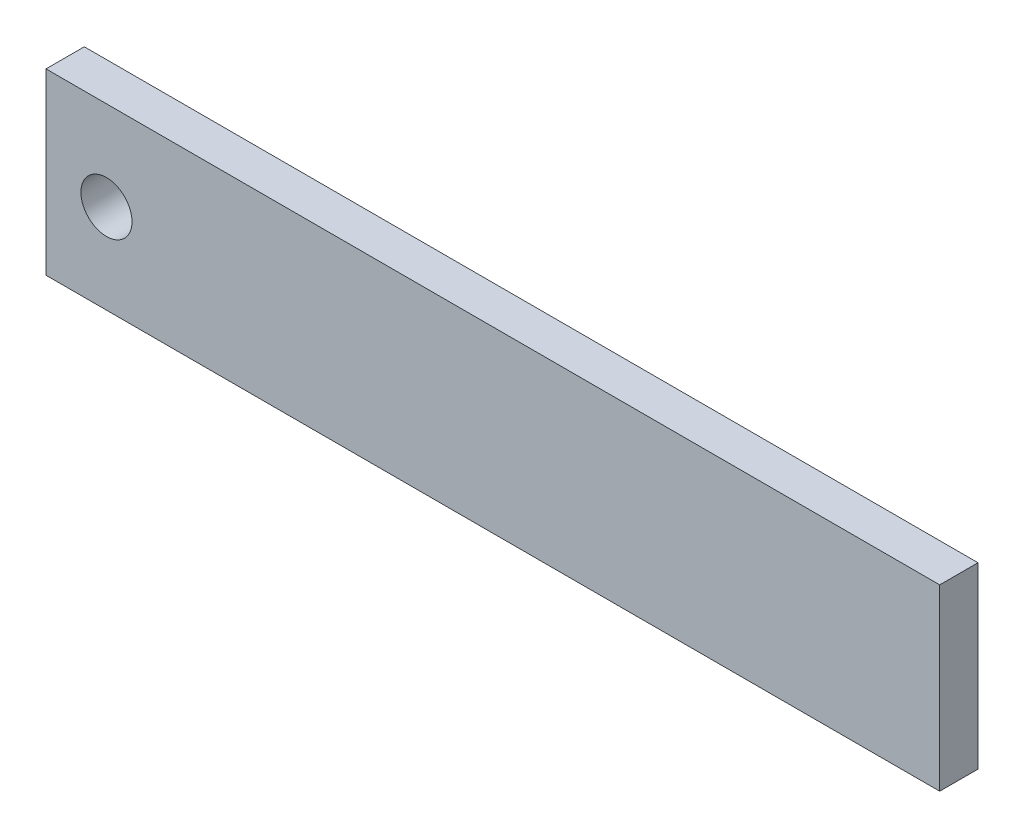
ISO-10303-21;
HEADER;
FILE_DESCRIPTION(('STEP AP214'),'2;1');
FILE_NAME('part.step','',(''),(''),'','','');
FILE_SCHEMA(('AUTOMOTIVE_DESIGN { 1 0 10303 214 1 1 1 1 }'));
ENDSEC;
DATA;
#1=APPLICATION_CONTEXT('core data for automotive mechanical design processes');
#2=APPLICATION_PROTOCOL_DEFINITION('international standard','automotive_design',2000,#1);
#3=PRODUCT_CONTEXT('',#1,'mechanical');
#4=PRODUCT('Part','Part','',(#3));
#5=PRODUCT_RELATED_PRODUCT_CATEGORY('part','',(#4));
#6=PRODUCT_DEFINITION_FORMATION('','',#4);
#7=PRODUCT_DEFINITION_CONTEXT('part definition',#1,'design');
#8=PRODUCT_DEFINITION('design','',#6,#7);
#9=PRODUCT_DEFINITION_SHAPE('','',#8);
#10=(LENGTH_UNIT() NAMED_UNIT(*) SI_UNIT(.MILLI.,.METRE.));
#11=(NAMED_UNIT(*) PLANE_ANGLE_UNIT() SI_UNIT($,.RADIAN.));
#12=(NAMED_UNIT(*) SI_UNIT($,.STERADIAN.) SOLID_ANGLE_UNIT());
#13=UNCERTAINTY_MEASURE_WITH_UNIT(LENGTH_MEASURE(1.E-05),#10,'distance_accuracy_value','');
#14=(GEOMETRIC_REPRESENTATION_CONTEXT(3) GLOBAL_UNCERTAINTY_ASSIGNED_CONTEXT((#13)) GLOBAL_UNIT_ASSIGNED_CONTEXT((#10,
#11,#12)) REPRESENTATION_CONTEXT('',''));
#15=CARTESIAN_POINT('',(0.,0.,0.));
#16=DIRECTION('',(0.,0.,1.));
#17=DIRECTION('',(1.,0.,0.));
#18=AXIS2_PLACEMENT_3D('',#15,#16,#17);
#19=CARTESIAN_POINT('',(0.,0.,15.));
#20=DIRECTION('',(1.,0.,0.));
#21=DIRECTION('',(0.,0.,-1.));
#22=AXIS2_PLACEMENT_3D('',#19,#20,#21);
#23=PLANE('',#22);
#24=DIRECTION('',(0.,-1.,0.));
#25=VECTOR('',#24,1.);
#26=CARTESIAN_POINT('',(0.,0.,0.));
#27=LINE('',#26,#25);
#28=CARTESIAN_POINT('',(0.,70.,0.));
#29=VERTEX_POINT('',#28);
#30=CARTESIAN_POINT('',(0.,0.,0.));
#31=VERTEX_POINT('',#30);
#32=EDGE_CURVE('E96',#29,#31,#27,.T.);
#33=ORIENTED_EDGE('',*,*,#32,.T.);
#34=DIRECTION('',(0.,0.,-1.));
#35=VECTOR('',#34,1.);
#36=CARTESIAN_POINT('',(0.,0.,15.));
#37=LINE('',#36,#35);
#38=CARTESIAN_POINT('',(0.,0.,15.));
#39=VERTEX_POINT('',#38);
#40=EDGE_CURVE('E11',#39,#31,#37,.T.);
#41=ORIENTED_EDGE('',*,*,#40,.F.);
#42=DIRECTION('',(0.,-1.,0.));
#43=VECTOR('',#42,1.);
#44=CARTESIAN_POINT('',(0.,0.,15.));
#45=LINE('',#44,#43);
#46=CARTESIAN_POINT('',(0.,70.,15.));
#47=VERTEX_POINT('',#46);
#48=EDGE_CURVE('E83',#47,#39,#45,.T.);
#49=ORIENTED_EDGE('',*,*,#48,.F.);
#50=DIRECTION('',(0.,0.,-1.));
#51=VECTOR('',#50,1.);
#52=CARTESIAN_POINT('',(0.,70.,15.));
#53=LINE('',#52,#51);
#54=EDGE_CURVE('E92',#47,#29,#53,.T.);
#55=ORIENTED_EDGE('',*,*,#54,.T.);
#56=EDGE_LOOP('',(#33,#41,#49,#55));
#57=FACE_BOUND('',#56,.T.);
#58=ADVANCED_FACE('F31',(#57),#23,.F.);
#59=CARTESIAN_POINT('',(0.,0.,15.));
#60=DIRECTION('',(0.,1.,0.));
#61=DIRECTION('',(0.,0.,1.));
#62=AXIS2_PLACEMENT_3D('',#59,#60,#61);
#63=PLANE('',#62);
#64=DIRECTION('',(1.,0.,0.));
#65=VECTOR('',#64,1.);
#66=CARTESIAN_POINT('',(0.,0.,0.));
#67=LINE('',#66,#65);
#68=CARTESIAN_POINT('',(350.,0.,0.));
#69=VERTEX_POINT('',#68);
#70=EDGE_CURVE('E87',#31,#69,#67,.T.);
#71=ORIENTED_EDGE('',*,*,#70,.T.);
#72=DIRECTION('',(0.,0.,-1.));
#73=VECTOR('',#72,1.);
#74=CARTESIAN_POINT('',(350.,0.,15.));
#75=LINE('',#74,#73);
#76=CARTESIAN_POINT('',(350.,0.,15.));
#77=VERTEX_POINT('',#76);
#78=EDGE_CURVE('E40',#77,#69,#75,.T.);
#79=ORIENTED_EDGE('',*,*,#78,.F.);
#80=DIRECTION('',(1.,0.,0.));
#81=VECTOR('',#80,1.);
#82=CARTESIAN_POINT('',(0.,0.,15.));
#83=LINE('',#82,#81);
#84=EDGE_CURVE('E78',#39,#77,#83,.T.);
#85=ORIENTED_EDGE('',*,*,#84,.F.);
#86=ORIENTED_EDGE('',*,*,#40,.T.);
#87=EDGE_LOOP('',(#71,#79,#85,#86));
#88=FACE_BOUND('',#87,.T.);
#89=ADVANCED_FACE('F86',(#88),#63,.F.);
#90=CARTESIAN_POINT('',(350.,0.,15.));
#91=DIRECTION('',(-1.,0.,0.));
#92=DIRECTION('',(0.,0.,1.));
#93=AXIS2_PLACEMENT_3D('',#90,#91,#92);
#94=PLANE('',#93);
#95=DIRECTION('',(0.,1.,0.));
#96=VECTOR('',#95,1.);
#97=CARTESIAN_POINT('',(350.,0.,0.));
#98=LINE('',#97,#96);
#99=CARTESIAN_POINT('',(350.,70.,0.));
#100=VERTEX_POINT('',#99);
#101=EDGE_CURVE('E65',#69,#100,#98,.T.);
#102=ORIENTED_EDGE('',*,*,#101,.T.);
#103=DIRECTION('',(0.,0.,-1.));
#104=VECTOR('',#103,1.);
#105=CARTESIAN_POINT('',(350.,70.,15.));
#106=LINE('',#105,#104);
#107=CARTESIAN_POINT('',(350.,70.,15.));
#108=VERTEX_POINT('',#107);
#109=EDGE_CURVE('E88',#108,#100,#106,.T.);
#110=ORIENTED_EDGE('',*,*,#109,.F.);
#111=DIRECTION('',(0.,1.,0.));
#112=VECTOR('',#111,1.);
#113=CARTESIAN_POINT('',(350.,0.,15.));
#114=LINE('',#113,#112);
#115=EDGE_CURVE('E81',#77,#108,#114,.T.);
#116=ORIENTED_EDGE('',*,*,#115,.F.);
#117=ORIENTED_EDGE('',*,*,#78,.T.);
#118=EDGE_LOOP('',(#102,#110,#116,#117));
#119=FACE_BOUND('',#118,.T.);
#120=ADVANCED_FACE('F90',(#119),#94,.F.);
#121=CARTESIAN_POINT('',(0.,70.,15.));
#122=DIRECTION('',(0.,-1.,0.));
#123=DIRECTION('',(0.,0.,-1.));
#124=AXIS2_PLACEMENT_3D('',#121,#122,#123);
#125=PLANE('',#124);
#126=DIRECTION('',(-1.,0.,0.));
#127=VECTOR('',#126,1.);
#128=CARTESIAN_POINT('',(0.,70.,0.));
#129=LINE('',#128,#127);
#130=EDGE_CURVE('E71',#100,#29,#129,.T.);
#131=ORIENTED_EDGE('',*,*,#130,.T.);
#132=ORIENTED_EDGE('',*,*,#54,.F.);
#133=DIRECTION('',(-1.,0.,0.));
#134=VECTOR('',#133,1.);
#135=CARTESIAN_POINT('',(0.,70.,15.));
#136=LINE('',#135,#134);
#137=EDGE_CURVE('E48',#108,#47,#136,.T.);
#138=ORIENTED_EDGE('',*,*,#137,.F.);
#139=ORIENTED_EDGE('',*,*,#109,.T.);
#140=EDGE_LOOP('',(#131,#132,#138,#139));
#141=FACE_BOUND('',#140,.T.);
#142=ADVANCED_FACE('F103',(#141),#125,.F.);
#143=CARTESIAN_POINT('',(0.,70.,15.));
#144=DIRECTION('',(0.,0.,-1.));
#145=DIRECTION('',(-1.,0.,0.));
#146=AXIS2_PLACEMENT_3D('',#143,#144,#145);
#147=PLANE('',#146);
#148=CARTESIAN_POINT('',(23.6768327764025,35.,15.));
#149=DIRECTION('',(0.,0.,1.));
#150=DIRECTION('',(1.,0.,0.));
#151=AXIS2_PLACEMENT_3D('',#148,#149,#150);
#152=CIRCLE('',#151,10.);
#153=CARTESIAN_POINT('',(33.6768327764025,35.,15.));
#154=VERTEX_POINT('',#153);
#155=EDGE_CURVE('E109',#154,#154,#152,.T.);
#156=ORIENTED_EDGE('',*,*,#155,.F.);
#157=EDGE_LOOP('',(#156));
#158=FACE_BOUND('',#157,.T.);
#159=ORIENTED_EDGE('',*,*,#48,.T.);
#160=ORIENTED_EDGE('',*,*,#84,.T.);
#161=ORIENTED_EDGE('',*,*,#115,.T.);
#162=ORIENTED_EDGE('',*,*,#137,.T.);
#163=EDGE_LOOP('',(#159,#160,#161,#162));
#164=FACE_BOUND('',#163,.T.);
#165=ADVANCED_FACE('F79',(#158,#164),#147,.F.);
#166=CARTESIAN_POINT('',(0.,70.,0.));
#167=DIRECTION('',(0.,0.,-1.));
#168=DIRECTION('',(-1.,0.,0.));
#169=AXIS2_PLACEMENT_3D('',#166,#167,#168);
#170=PLANE('',#169);
#171=CARTESIAN_POINT('',(23.6768327764025,35.,0.));
#172=DIRECTION('',(0.,0.,-1.));
#173=DIRECTION('',(-1.,0.,0.));
#174=AXIS2_PLACEMENT_3D('',#171,#172,#173);
#175=CIRCLE('',#174,10.);
#176=CARTESIAN_POINT('',(13.6768327764025,35.,0.));
#177=VERTEX_POINT('',#176);
#178=EDGE_CURVE('E34',#177,#177,#175,.T.);
#179=ORIENTED_EDGE('',*,*,#178,.F.);
#180=EDGE_LOOP('',(#179));
#181=FACE_BOUND('',#180,.T.);
#182=ORIENTED_EDGE('',*,*,#32,.F.);
#183=ORIENTED_EDGE('',*,*,#130,.F.);
#184=ORIENTED_EDGE('',*,*,#101,.F.);
#185=ORIENTED_EDGE('',*,*,#70,.F.);
#186=EDGE_LOOP('',(#182,#183,#184,#185));
#187=FACE_BOUND('',#186,.T.);
#188=ADVANCED_FACE('F106',(#181,#187),#170,.T.);
#189=CARTESIAN_POINT('',(23.6768327764025,35.,-115.));
#190=DIRECTION('',(0.,0.,1.));
#191=DIRECTION('',(1.,0.,0.));
#192=AXIS2_PLACEMENT_3D('',#189,#190,#191);
#193=CYLINDRICAL_SURFACE('',#192,10.);
#194=ORIENTED_EDGE('',*,*,#178,.T.);
#195=EDGE_LOOP('',(#194));
#196=FACE_BOUND('',#195,.T.);
#197=ORIENTED_EDGE('',*,*,#155,.T.);
#198=EDGE_LOOP('',(#197));
#199=FACE_BOUND('',#198,.T.);
#200=ADVANCED_FACE('F116',(#196,#199),#193,.F.);
#201=CLOSED_SHELL('',(#58,#89,#120,#142,#165,#188,#200));
#202=MANIFOLD_SOLID_BREP('B2',#201);
#203=ADVANCED_BREP_SHAPE_REPRESENTATION('',(#18,#202),#14);
#204=SHAPE_DEFINITION_REPRESENTATION(#9,#203);
ENDSEC;
END-ISO-10303-21;
